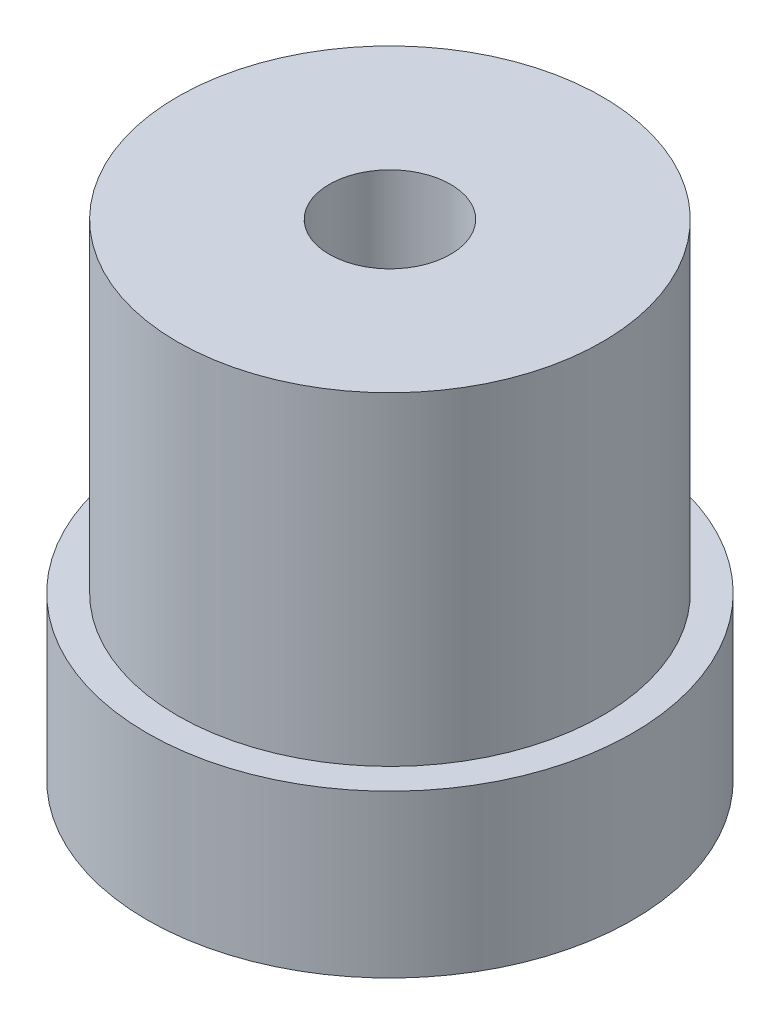
ISO-10303-21;
HEADER;
FILE_DESCRIPTION(('STEP AP214'),'2;1');
FILE_NAME('part.step','',(''),(''),'','','');
FILE_SCHEMA(('AUTOMOTIVE_DESIGN { 1 0 10303 214 1 1 1 1 }'));
ENDSEC;
DATA;
#1=APPLICATION_CONTEXT('core data for automotive mechanical design processes');
#2=APPLICATION_PROTOCOL_DEFINITION('international standard','automotive_design',2000,#1);
#3=PRODUCT_CONTEXT('',#1,'mechanical');
#4=PRODUCT('Part','Part','',(#3));
#5=PRODUCT_RELATED_PRODUCT_CATEGORY('part','',(#4));
#6=PRODUCT_DEFINITION_FORMATION('','',#4);
#7=PRODUCT_DEFINITION_CONTEXT('part definition',#1,'design');
#8=PRODUCT_DEFINITION('design','',#6,#7);
#9=PRODUCT_DEFINITION_SHAPE('','',#8);
#10=(LENGTH_UNIT() NAMED_UNIT(*) SI_UNIT(.MILLI.,.METRE.));
#11=(NAMED_UNIT(*) PLANE_ANGLE_UNIT() SI_UNIT($,.RADIAN.));
#12=(NAMED_UNIT(*) SI_UNIT($,.STERADIAN.) SOLID_ANGLE_UNIT());
#13=UNCERTAINTY_MEASURE_WITH_UNIT(LENGTH_MEASURE(1.E-05),#10,'distance_accuracy_value','');
#14=(GEOMETRIC_REPRESENTATION_CONTEXT(3) GLOBAL_UNCERTAINTY_ASSIGNED_CONTEXT((#13)) GLOBAL_UNIT_ASSIGNED_CONTEXT((#10,
#11,#12)) REPRESENTATION_CONTEXT('',''));
#15=CARTESIAN_POINT('',(0.,0.,0.));
#16=DIRECTION('',(0.,0.,1.));
#17=DIRECTION('',(1.,0.,0.));
#18=AXIS2_PLACEMENT_3D('',#15,#16,#17);
#19=CARTESIAN_POINT('',(0.,50.8,0.));
#20=DIRECTION('',(0.,-1.,0.));
#21=DIRECTION('',(0.,0.,-1.));
#22=AXIS2_PLACEMENT_3D('',#19,#20,#21);
#23=CYLINDRICAL_SURFACE('',#22,76.2);
#24=CARTESIAN_POINT('',(0.,50.8,0.));
#25=DIRECTION('',(0.,1.,0.));
#26=DIRECTION('',(0.,0.,1.));
#27=AXIS2_PLACEMENT_3D('',#24,#25,#26);
#28=CIRCLE('',#27,76.2);
#29=CARTESIAN_POINT('',(0.,50.8,76.2));
#30=VERTEX_POINT('',#29);
#31=EDGE_CURVE('E44',#30,#30,#28,.T.);
#32=ORIENTED_EDGE('',*,*,#31,.F.);
#33=EDGE_LOOP('',(#32));
#34=FACE_BOUND('',#33,.T.);
#35=CARTESIAN_POINT('',(0.,0.,0.));
#36=DIRECTION('',(0.,1.,0.));
#37=DIRECTION('',(0.,0.,1.));
#38=AXIS2_PLACEMENT_3D('',#35,#36,#37);
#39=CIRCLE('',#38,76.2);
#40=CARTESIAN_POINT('',(0.,0.,76.2));
#41=VERTEX_POINT('',#40);
#42=EDGE_CURVE('E40',#41,#41,#39,.T.);
#43=ORIENTED_EDGE('',*,*,#42,.T.);
#44=EDGE_LOOP('',(#43));
#45=FACE_BOUND('',#44,.T.);
#46=ADVANCED_FACE('F37',(#34,#45),#23,.T.);
#47=CARTESIAN_POINT('',(0.,50.8,0.));
#48=DIRECTION('',(0.,1.,0.));
#49=DIRECTION('',(0.,0.,1.));
#50=AXIS2_PLACEMENT_3D('',#47,#48,#49);
#51=PLANE('',#50);
#52=CARTESIAN_POINT('',(0.,50.8,0.));
#53=DIRECTION('',(0.,1.,0.));
#54=DIRECTION('',(0.,0.,1.));
#55=AXIS2_PLACEMENT_3D('',#52,#53,#54);
#56=CIRCLE('',#55,66.675);
#57=CARTESIAN_POINT('',(0.,50.8,66.675));
#58=VERTEX_POINT('',#57);
#59=EDGE_CURVE('E10',#58,#58,#56,.T.);
#60=ORIENTED_EDGE('',*,*,#59,.F.);
#61=EDGE_LOOP('',(#60));
#62=FACE_BOUND('',#61,.T.);
#63=ORIENTED_EDGE('',*,*,#31,.T.);
#64=EDGE_LOOP('',(#63));
#65=FACE_BOUND('',#64,.T.);
#66=ADVANCED_FACE('F82',(#62,#65),#51,.T.);
#67=CARTESIAN_POINT('',(0.,0.,0.));
#68=DIRECTION('',(0.,1.,0.));
#69=DIRECTION('',(0.,0.,1.));
#70=AXIS2_PLACEMENT_3D('',#67,#68,#69);
#71=PLANE('',#70);
#72=ORIENTED_EDGE('',*,*,#42,.F.);
#73=EDGE_LOOP('',(#72));
#74=FACE_BOUND('',#73,.T.);
#75=ADVANCED_FACE('F76',(#74),#71,.F.);
#76=CARTESIAN_POINT('',(0.,152.4,0.));
#77=DIRECTION('',(0.,-1.,0.));
#78=DIRECTION('',(0.,0.,-1.));
#79=AXIS2_PLACEMENT_3D('',#76,#77,#78);
#80=CYLINDRICAL_SURFACE('',#79,66.675);
#81=CARTESIAN_POINT('',(0.,152.4,0.));
#82=DIRECTION('',(0.,1.,0.));
#83=DIRECTION('',(0.,0.,1.));
#84=AXIS2_PLACEMENT_3D('',#81,#82,#83);
#85=CIRCLE('',#84,66.675);
#86=CARTESIAN_POINT('',(0.,152.4,66.675));
#87=VERTEX_POINT('',#86);
#88=EDGE_CURVE('E50',#87,#87,#85,.T.);
#89=ORIENTED_EDGE('',*,*,#88,.F.);
#90=EDGE_LOOP('',(#89));
#91=FACE_BOUND('',#90,.T.);
#92=ORIENTED_EDGE('',*,*,#59,.T.);
#93=EDGE_LOOP('',(#92));
#94=FACE_BOUND('',#93,.T.);
#95=ADVANCED_FACE('F71',(#91,#94),#80,.T.);
#96=CARTESIAN_POINT('',(0.,152.4,0.));
#97=DIRECTION('',(0.,1.,0.));
#98=DIRECTION('',(0.,0.,1.));
#99=AXIS2_PLACEMENT_3D('',#96,#97,#98);
#100=PLANE('',#99);
#101=CARTESIAN_POINT('',(0.,152.4,0.));
#102=DIRECTION('',(0.,1.,0.));
#103=DIRECTION('',(0.,0.,1.));
#104=AXIS2_PLACEMENT_3D('',#101,#102,#103);
#105=CIRCLE('',#104,19.05);
#106=CARTESIAN_POINT('',(0.,152.4,19.05));
#107=VERTEX_POINT('',#106);
#108=EDGE_CURVE('E54',#107,#107,#105,.T.);
#109=ORIENTED_EDGE('',*,*,#108,.F.);
#110=EDGE_LOOP('',(#109));
#111=FACE_BOUND('',#110,.T.);
#112=ORIENTED_EDGE('',*,*,#88,.T.);
#113=EDGE_LOOP('',(#112));
#114=FACE_BOUND('',#113,.T.);
#115=ADVANCED_FACE('F65',(#111,#114),#100,.T.);
#116=CARTESIAN_POINT('',(0.,114.3,0.));
#117=DIRECTION('',(0.,1.,0.));
#118=DIRECTION('',(0.,0.,1.));
#119=AXIS2_PLACEMENT_3D('',#116,#117,#118);
#120=CYLINDRICAL_SURFACE('',#119,19.05);
#121=CARTESIAN_POINT('',(0.,114.3,0.));
#122=DIRECTION('',(0.,1.,0.));
#123=DIRECTION('',(0.,0.,1.));
#124=AXIS2_PLACEMENT_3D('',#121,#122,#123);
#125=CIRCLE('',#124,19.05);
#126=CARTESIAN_POINT('',(0.,114.3,19.05));
#127=VERTEX_POINT('',#126);
#128=EDGE_CURVE('E53',#127,#127,#125,.T.);
#129=CARTESIAN_POINT('',(0.,114.3,19.05));
#130=CARTESIAN_POINT('',(0.,114.696875,19.05));
#131=CARTESIAN_POINT('',(0.,115.09375,19.05));
#132=CARTESIAN_POINT('',(0.,115.8875,19.05));
#133=CARTESIAN_POINT('',(0.,116.284375,19.05));
#134=CARTESIAN_POINT('',(0.,117.078125,19.05));
#135=CARTESIAN_POINT('',(0.,117.475,19.05));
#136=CARTESIAN_POINT('',(0.,118.26875,19.05));
#137=CARTESIAN_POINT('',(0.,118.665625,19.05));
#138=CARTESIAN_POINT('',(0.,119.459375,19.05));
#139=CARTESIAN_POINT('',(0.,119.85625,19.05));
#140=CARTESIAN_POINT('',(0.,120.65,19.05));
#141=CARTESIAN_POINT('',(0.,121.046875,19.05));
#142=CARTESIAN_POINT('',(0.,121.840625,19.05));
#143=CARTESIAN_POINT('',(0.,122.2375,19.05));
#144=CARTESIAN_POINT('',(0.,123.03125,19.05));
#145=CARTESIAN_POINT('',(0.,123.428125,19.05));
#146=CARTESIAN_POINT('',(0.,124.221875,19.05));
#147=CARTESIAN_POINT('',(0.,124.61875,19.05));
#148=CARTESIAN_POINT('',(0.,125.4125,19.05));
#149=CARTESIAN_POINT('',(0.,125.809375,19.05));
#150=CARTESIAN_POINT('',(0.,126.603125,19.05));
#151=CARTESIAN_POINT('',(0.,127.,19.05));
#152=CARTESIAN_POINT('',(0.,127.79375,19.05));
#153=CARTESIAN_POINT('',(0.,128.190625,19.05));
#154=CARTESIAN_POINT('',(0.,128.984375,19.05));
#155=CARTESIAN_POINT('',(0.,129.38125,19.05));
#156=CARTESIAN_POINT('',(0.,130.175,19.05));
#157=CARTESIAN_POINT('',(0.,130.571875,19.05));
#158=CARTESIAN_POINT('',(0.,131.365625,19.05));
#159=CARTESIAN_POINT('',(0.,131.7625,19.05));
#160=CARTESIAN_POINT('',(0.,132.55625,19.05));
#161=CARTESIAN_POINT('',(0.,132.953125,19.05));
#162=CARTESIAN_POINT('',(0.,133.746875,19.05));
#163=CARTESIAN_POINT('',(0.,134.14375,19.05));
#164=CARTESIAN_POINT('',(0.,134.9375,19.05));
#165=CARTESIAN_POINT('',(0.,135.334375,19.05));
#166=CARTESIAN_POINT('',(0.,136.128125,19.05));
#167=CARTESIAN_POINT('',(0.,136.525,19.05));
#168=CARTESIAN_POINT('',(0.,137.31875,19.05));
#169=CARTESIAN_POINT('',(0.,137.715625,19.05));
#170=CARTESIAN_POINT('',(0.,138.509375,19.05));
#171=CARTESIAN_POINT('',(0.,138.90625,19.05));
#172=CARTESIAN_POINT('',(0.,139.7,19.05));
#173=CARTESIAN_POINT('',(0.,140.096875,19.05));
#174=CARTESIAN_POINT('',(0.,140.890625,19.05));
#175=CARTESIAN_POINT('',(0.,141.2875,19.05));
#176=CARTESIAN_POINT('',(0.,142.08125,19.05));
#177=CARTESIAN_POINT('',(0.,142.478125,19.05));
#178=CARTESIAN_POINT('',(0.,143.271875,19.05));
#179=CARTESIAN_POINT('',(0.,143.66875,19.05));
#180=CARTESIAN_POINT('',(0.,144.4625,19.05));
#181=CARTESIAN_POINT('',(0.,144.859375,19.05));
#182=CARTESIAN_POINT('',(0.,145.653125,19.05));
#183=CARTESIAN_POINT('',(0.,146.05,19.05));
#184=CARTESIAN_POINT('',(0.,146.84375,19.05));
#185=CARTESIAN_POINT('',(0.,147.240625,19.05));
#186=CARTESIAN_POINT('',(0.,148.034375,19.05));
#187=CARTESIAN_POINT('',(0.,148.43125,19.05));
#188=CARTESIAN_POINT('',(0.,149.225,19.05));
#189=CARTESIAN_POINT('',(0.,149.621875,19.05));
#190=CARTESIAN_POINT('',(0.,150.415625,19.05));
#191=CARTESIAN_POINT('',(0.,150.8125,19.05));
#192=CARTESIAN_POINT('',(0.,151.60625,19.05));
#193=CARTESIAN_POINT('',(0.,152.003125,19.05));
#194=CARTESIAN_POINT('',(0.,152.4,19.05));
#195=B_SPLINE_CURVE_WITH_KNOTS('',3,(#129,#130,#131,#132,#133,#134,#135,#136,#137,#138,#139,
#140,#141,#142,#143,#144,#145,#146,#147,#148,#149,#150,#151,#152,#153,#154,#155,#156,#157,#158,
#159,#160,#161,#162,#163,#164,#165,#166,#167,#168,#169,#170,#171,#172,#173,#174,#175,#176,#177,
#178,#179,#180,#181,#182,#183,#184,#185,#186,#187,#188,#189,#190,#191,#192,#193,#194),
.UNSPECIFIED.,.F.,.F.,(4,2,2,2,2,2,2,2,2,2,2,2,2,2,2,2,2,2,2,2,2,2,2,2,2,2,2,2,2,2,2,2,4),(0.,
1.190625,2.38125,3.571875,4.7625,5.953125,7.14375,8.334375,9.52500000000001,10.715625,11.90625,
13.096875,14.2875,15.478125,16.66875,17.859375,19.05,20.240625,21.43125,22.621875,23.8125,
25.003125,26.19375,27.384375,28.575,29.765625,30.95625,32.146875,33.3375,34.528125,35.71875,
36.909375,38.1),.UNSPECIFIED.);
#196=EDGE_CURVE('BSEAM62',#127,#107,#195,.T.);
#197=ORIENTED_EDGE('',*,*,#128,.F.);
#198=ORIENTED_EDGE('',*,*,#108,.T.);
#199=ORIENTED_EDGE('',*,*,#196,.T.);
#200=ORIENTED_EDGE('',*,*,#196,.F.);
#201=EDGE_LOOP('',(#197,#199,#198,#200));
#202=FACE_BOUND('',#201,.T.);
#203=ADVANCED_FACE('F62',(#202),#120,.F.);
#204=CARTESIAN_POINT('',(0.,114.3,0.));
#205=DIRECTION('',(0.,1.,0.));
#206=DIRECTION('',(0.,0.,1.));
#207=AXIS2_PLACEMENT_3D('',#204,#205,#206);
#208=PLANE('',#207);
#209=ORIENTED_EDGE('',*,*,#128,.T.);
#210=EDGE_LOOP('',(#209));
#211=FACE_BOUND('',#210,.T.);
#212=ADVANCED_FACE('F60',(#211),#208,.T.);
#213=CLOSED_SHELL('',(#46,#66,#75,#95,#115,#203,#212));
#214=MANIFOLD_SOLID_BREP('B2',#213);
#215=ADVANCED_BREP_SHAPE_REPRESENTATION('',(#18,#214),#14);
#216=SHAPE_DEFINITION_REPRESENTATION(#9,#215);
ENDSEC;
END-ISO-10303-21;
